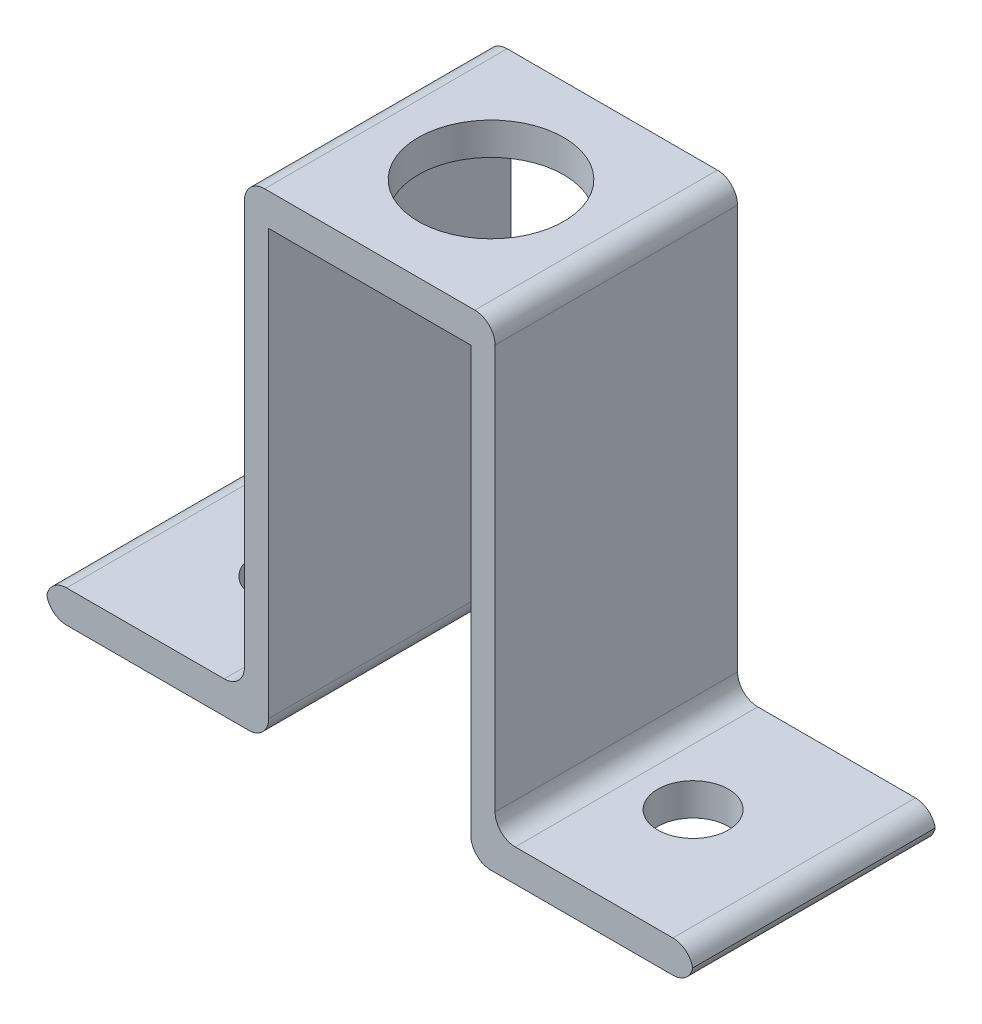
ISO-10303-21;
HEADER;
FILE_DESCRIPTION(('STEP AP214'),'2;1');
FILE_NAME('part.step','',(''),(''),'','','');
FILE_SCHEMA(('AUTOMOTIVE_DESIGN { 1 0 10303 214 1 1 1 1 }'));
ENDSEC;
DATA;
#1=APPLICATION_CONTEXT('core data for automotive mechanical design processes');
#2=APPLICATION_PROTOCOL_DEFINITION('international standard','automotive_design',2000,#1);
#3=PRODUCT_CONTEXT('',#1,'mechanical');
#4=PRODUCT('Part','Part','',(#3));
#5=PRODUCT_RELATED_PRODUCT_CATEGORY('part','',(#4));
#6=PRODUCT_DEFINITION_FORMATION('','',#4);
#7=PRODUCT_DEFINITION_CONTEXT('part definition',#1,'design');
#8=PRODUCT_DEFINITION('design','',#6,#7);
#9=PRODUCT_DEFINITION_SHAPE('','',#8);
#10=(LENGTH_UNIT() NAMED_UNIT(*) SI_UNIT(.MILLI.,.METRE.));
#11=(NAMED_UNIT(*) PLANE_ANGLE_UNIT() SI_UNIT($,.RADIAN.));
#12=(NAMED_UNIT(*) SI_UNIT($,.STERADIAN.) SOLID_ANGLE_UNIT());
#13=UNCERTAINTY_MEASURE_WITH_UNIT(LENGTH_MEASURE(1.E-05),#10,'distance_accuracy_value','');
#14=(GEOMETRIC_REPRESENTATION_CONTEXT(3) GLOBAL_UNCERTAINTY_ASSIGNED_CONTEXT((#13)) GLOBAL_UNIT_ASSIGNED_CONTEXT((#10,
#11,#12)) REPRESENTATION_CONTEXT('',''));
#15=CARTESIAN_POINT('',(0.,0.,0.));
#16=DIRECTION('',(0.,0.,1.));
#17=DIRECTION('',(1.,0.,0.));
#18=AXIS2_PLACEMENT_3D('',#15,#16,#17);
#19=CARTESIAN_POINT('',(6.2,-20.4,12.));
#20=DIRECTION('',(-1.,0.,0.));
#21=DIRECTION('',(0.,0.,1.));
#22=AXIS2_PLACEMENT_3D('',#19,#20,#21);
#23=PLANE('',#22);
#24=DIRECTION('',(0.,1.,0.));
#25=VECTOR('',#24,1.);
#26=CARTESIAN_POINT('',(6.2,-20.4,0.));
#27=LINE('',#26,#25);
#28=CARTESIAN_POINT('',(6.2,-19.4,0.));
#29=VERTEX_POINT('',#28);
#30=CARTESIAN_POINT('',(6.2,0.6,0.));
#31=VERTEX_POINT('',#30);
#32=EDGE_CURVE('E208',#29,#31,#27,.T.);
#33=ORIENTED_EDGE('',*,*,#32,.T.);
#34=DIRECTION('',(0.,0.,-1.));
#35=VECTOR('',#34,1.);
#36=CARTESIAN_POINT('',(6.2,0.6,12.));
#37=LINE('',#36,#35);
#38=CARTESIAN_POINT('',(6.2,0.6,12.));
#39=VERTEX_POINT('',#38);
#40=EDGE_CURVE('E302',#31,#39,#37,.F.);
#41=ORIENTED_EDGE('',*,*,#40,.T.);
#42=DIRECTION('',(0.,1.,0.));
#43=VECTOR('',#42,1.);
#44=CARTESIAN_POINT('',(6.2,-20.4,12.));
#45=LINE('',#44,#43);
#46=CARTESIAN_POINT('',(6.2,-19.4,12.));
#47=VERTEX_POINT('',#46);
#48=EDGE_CURVE('E236',#47,#39,#45,.T.);
#49=ORIENTED_EDGE('',*,*,#48,.F.);
#50=DIRECTION('',(0.,0.,-1.));
#51=VECTOR('',#50,1.);
#52=CARTESIAN_POINT('',(6.2,-19.4,0.));
#53=LINE('',#52,#51);
#54=EDGE_CURVE('E299',#47,#29,#53,.T.);
#55=ORIENTED_EDGE('',*,*,#54,.T.);
#56=EDGE_LOOP('',(#33,#41,#49,#55));
#57=FACE_BOUND('',#56,.T.);
#58=ADVANCED_FACE('F33',(#57),#23,.F.);
#59=CARTESIAN_POINT('',(-6.2,1.6,12.));
#60=DIRECTION('',(0.,-1.,0.));
#61=DIRECTION('',(0.,0.,-1.));
#62=AXIS2_PLACEMENT_3D('',#59,#60,#61);
#63=PLANE('',#62);
#64=CARTESIAN_POINT('',(0.,1.6,6.));
#65=DIRECTION('',(0.,1.,0.));
#66=DIRECTION('',(-1.,0.,0.));
#67=AXIS2_PLACEMENT_3D('',#64,#65,#66);
#68=CIRCLE('',#67,3.6);
#69=CARTESIAN_POINT('',(-3.6,1.6,6.));
#70=VERTEX_POINT('',#69);
#71=EDGE_CURVE('E240',#70,#70,#68,.T.);
#72=ORIENTED_EDGE('',*,*,#71,.F.);
#73=EDGE_LOOP('',(#72));
#74=FACE_BOUND('',#73,.T.);
#75=DIRECTION('',(-1.,0.,0.));
#76=VECTOR('',#75,1.);
#77=CARTESIAN_POINT('',(-6.2,1.6,0.));
#78=LINE('',#77,#76);
#79=CARTESIAN_POINT('',(5.2,1.6,0.));
#80=VERTEX_POINT('',#79);
#81=CARTESIAN_POINT('',(-5.2,1.6,0.));
#82=VERTEX_POINT('',#81);
#83=EDGE_CURVE('E211',#80,#82,#78,.T.);
#84=ORIENTED_EDGE('',*,*,#83,.T.);
#85=DIRECTION('',(0.,0.,-1.));
#86=VECTOR('',#85,1.);
#87=CARTESIAN_POINT('',(-5.2,1.6,12.));
#88=LINE('',#87,#86);
#89=CARTESIAN_POINT('',(-5.2,1.6,12.));
#90=VERTEX_POINT('',#89);
#91=EDGE_CURVE('E297',#82,#90,#88,.F.);
#92=ORIENTED_EDGE('',*,*,#91,.T.);
#93=DIRECTION('',(-1.,0.,0.));
#94=VECTOR('',#93,1.);
#95=CARTESIAN_POINT('',(-6.2,1.6,12.));
#96=LINE('',#95,#94);
#97=CARTESIAN_POINT('',(5.2,1.6,12.));
#98=VERTEX_POINT('',#97);
#99=EDGE_CURVE('E360',#98,#90,#96,.T.);
#100=ORIENTED_EDGE('',*,*,#99,.F.);
#101=DIRECTION('',(0.,0.,-1.));
#102=VECTOR('',#101,1.);
#103=CARTESIAN_POINT('',(5.2,1.6,12.));
#104=LINE('',#103,#102);
#105=EDGE_CURVE('E294',#98,#80,#104,.T.);
#106=ORIENTED_EDGE('',*,*,#105,.T.);
#107=EDGE_LOOP('',(#84,#92,#100,#106));
#108=FACE_BOUND('',#107,.T.);
#109=ADVANCED_FACE('F356',(#74,#108),#63,.F.);
#110=CARTESIAN_POINT('',(-6.2,-20.4,12.));
#111=DIRECTION('',(1.,0.,0.));
#112=DIRECTION('',(0.,0.,-1.));
#113=AXIS2_PLACEMENT_3D('',#110,#111,#112);
#114=PLANE('',#113);
#115=DIRECTION('',(0.,-1.,0.));
#116=VECTOR('',#115,1.);
#117=CARTESIAN_POINT('',(-6.2,-20.4,0.));
#118=LINE('',#117,#116);
#119=CARTESIAN_POINT('',(-6.2,0.6,0.));
#120=VERTEX_POINT('',#119);
#121=CARTESIAN_POINT('',(-6.2,-19.4,0.));
#122=VERTEX_POINT('',#121);
#123=EDGE_CURVE('E215',#120,#122,#118,.T.);
#124=ORIENTED_EDGE('',*,*,#123,.T.);
#125=DIRECTION('',(0.,0.,-1.));
#126=VECTOR('',#125,1.);
#127=CARTESIAN_POINT('',(-6.2,-19.4,12.));
#128=LINE('',#127,#126);
#129=CARTESIAN_POINT('',(-6.2,-19.4,12.));
#130=VERTEX_POINT('',#129);
#131=EDGE_CURVE('E292',#122,#130,#128,.F.);
#132=ORIENTED_EDGE('',*,*,#131,.T.);
#133=DIRECTION('',(0.,-1.,0.));
#134=VECTOR('',#133,1.);
#135=CARTESIAN_POINT('',(-6.2,-20.4,12.));
#136=LINE('',#135,#134);
#137=CARTESIAN_POINT('',(-6.2,0.6,12.));
#138=VERTEX_POINT('',#137);
#139=EDGE_CURVE('E349',#138,#130,#136,.T.);
#140=ORIENTED_EDGE('',*,*,#139,.F.);
#141=DIRECTION('',(0.,0.,-1.));
#142=VECTOR('',#141,1.);
#143=CARTESIAN_POINT('',(-6.2,0.6,12.));
#144=LINE('',#143,#142);
#145=EDGE_CURVE('E289',#138,#120,#144,.T.);
#146=ORIENTED_EDGE('',*,*,#145,.T.);
#147=EDGE_LOOP('',(#124,#132,#140,#146));
#148=FACE_BOUND('',#147,.T.);
#149=ADVANCED_FACE('F345',(#148),#114,.F.);
#150=CARTESIAN_POINT('',(-6.2,-20.4,12.));
#151=DIRECTION('',(0.,-1.,0.));
#152=DIRECTION('',(1.,0.,0.));
#153=AXIS2_PLACEMENT_3D('',#150,#151,#152);
#154=PLANE('',#153);
#155=CARTESIAN_POINT('',(-10.,-20.4,6.));
#156=DIRECTION('',(0.,1.,0.));
#157=DIRECTION('',(-1.,0.,0.));
#158=AXIS2_PLACEMENT_3D('',#155,#156,#157);
#159=CIRCLE('',#158,1.75);
#160=CARTESIAN_POINT('',(-11.75,-20.4,6.));
#161=VERTEX_POINT('',#160);
#162=EDGE_CURVE('E449',#161,#161,#159,.T.);
#163=ORIENTED_EDGE('',*,*,#162,.F.);
#164=EDGE_LOOP('',(#163));
#165=FACE_BOUND('',#164,.T.);
#166=DIRECTION('',(-1.,0.,0.));
#167=VECTOR('',#166,1.);
#168=CARTESIAN_POINT('',(-6.2,-20.4,0.));
#169=LINE('',#168,#167);
#170=CARTESIAN_POINT('',(-7.2,-20.4,0.));
#171=VERTEX_POINT('',#170);
#172=CARTESIAN_POINT('',(-15.,-20.4,0.));
#173=VERTEX_POINT('',#172);
#174=EDGE_CURVE('E218',#171,#173,#169,.T.);
#175=ORIENTED_EDGE('',*,*,#174,.T.);
#176=DIRECTION('',(0.,0.,-1.));
#177=VECTOR('',#176,1.);
#178=CARTESIAN_POINT('',(-15.,-20.4,12.));
#179=LINE('',#178,#177);
#180=CARTESIAN_POINT('',(-15.,-20.4,12.));
#181=VERTEX_POINT('',#180);
#182=EDGE_CURVE('E287',#173,#181,#179,.F.);
#183=ORIENTED_EDGE('',*,*,#182,.T.);
#184=DIRECTION('',(-1.,0.,0.));
#185=VECTOR('',#184,1.);
#186=CARTESIAN_POINT('',(-6.2,-20.4,12.));
#187=LINE('',#186,#185);
#188=CARTESIAN_POINT('',(-7.2,-20.4,12.));
#189=VERTEX_POINT('',#188);
#190=EDGE_CURVE('E338',#189,#181,#187,.T.);
#191=ORIENTED_EDGE('',*,*,#190,.F.);
#192=DIRECTION('',(0.,0.,-1.));
#193=VECTOR('',#192,1.);
#194=CARTESIAN_POINT('',(-7.2,-20.4,0.));
#195=LINE('',#194,#193);
#196=EDGE_CURVE('E284',#189,#171,#195,.T.);
#197=ORIENTED_EDGE('',*,*,#196,.T.);
#198=EDGE_LOOP('',(#175,#183,#191,#197));
#199=FACE_BOUND('',#198,.T.);
#200=ADVANCED_FACE('F335',(#165,#199),#154,.F.);
#201=CARTESIAN_POINT('',(-5.,-22.,12.));
#202=DIRECTION('',(0.,1.,0.));
#203=DIRECTION('',(0.,0.,1.));
#204=AXIS2_PLACEMENT_3D('',#201,#202,#203);
#205=PLANE('',#204);
#206=CARTESIAN_POINT('',(-10.,-22.,6.));
#207=DIRECTION('',(0.,1.,0.));
#208=DIRECTION('',(-1.,0.,0.));
#209=AXIS2_PLACEMENT_3D('',#206,#207,#208);
#210=CIRCLE('',#209,1.75);
#211=CARTESIAN_POINT('',(-11.75,-22.,6.));
#212=VERTEX_POINT('',#211);
#213=EDGE_CURVE('E448',#212,#212,#210,.T.);
#214=ORIENTED_EDGE('',*,*,#213,.T.);
#215=EDGE_LOOP('',(#214));
#216=FACE_BOUND('',#215,.T.);
#217=DIRECTION('',(1.,0.,0.));
#218=VECTOR('',#217,1.);
#219=CARTESIAN_POINT('',(-5.,-22.,12.));
#220=LINE('',#219,#218);
#221=CARTESIAN_POINT('',(-15.,-22.,12.));
#222=VERTEX_POINT('',#221);
#223=CARTESIAN_POINT('',(-6.,-22.,12.));
#224=VERTEX_POINT('',#223);
#225=EDGE_CURVE('E183',#222,#224,#220,.T.);
#226=ORIENTED_EDGE('',*,*,#225,.F.);
#227=DIRECTION('',(0.,0.,-1.));
#228=VECTOR('',#227,1.);
#229=CARTESIAN_POINT('',(-15.,-22.,12.));
#230=LINE('',#229,#228);
#231=CARTESIAN_POINT('',(-15.,-22.,0.));
#232=VERTEX_POINT('',#231);
#233=EDGE_CURVE('E276',#222,#232,#230,.T.);
#234=ORIENTED_EDGE('',*,*,#233,.T.);
#235=DIRECTION('',(1.,0.,0.));
#236=VECTOR('',#235,1.);
#237=CARTESIAN_POINT('',(-5.,-22.,0.));
#238=LINE('',#237,#236);
#239=CARTESIAN_POINT('',(-6.,-22.,0.));
#240=VERTEX_POINT('',#239);
#241=EDGE_CURVE('E221',#232,#240,#238,.T.);
#242=ORIENTED_EDGE('',*,*,#241,.T.);
#243=DIRECTION('',(0.,0.,-1.));
#244=VECTOR('',#243,1.);
#245=CARTESIAN_POINT('',(-6.,-22.,12.));
#246=LINE('',#245,#244);
#247=EDGE_CURVE('E274',#240,#224,#246,.F.);
#248=ORIENTED_EDGE('',*,*,#247,.T.);
#249=EDGE_LOOP('',(#226,#234,#242,#248));
#250=FACE_BOUND('',#249,.T.);
#251=ADVANCED_FACE('F440',(#216,#250),#205,.F.);
#252=CARTESIAN_POINT('',(-5.,0.,12.));
#253=DIRECTION('',(-1.,0.,0.));
#254=DIRECTION('',(0.,-1.,0.));
#255=AXIS2_PLACEMENT_3D('',#252,#253,#254);
#256=PLANE('',#255);
#257=DIRECTION('',(0.,1.,0.));
#258=VECTOR('',#257,1.);
#259=CARTESIAN_POINT('',(-5.,0.,12.));
#260=LINE('',#259,#258);
#261=CARTESIAN_POINT('',(-5.,-21.,12.));
#262=VERTEX_POINT('',#261);
#263=CARTESIAN_POINT('',(-5.,0.,12.));
#264=VERTEX_POINT('',#263);
#265=EDGE_CURVE('E170',#262,#264,#260,.T.);
#266=ORIENTED_EDGE('',*,*,#265,.F.);
#267=DIRECTION('',(0.,0.,-1.));
#268=VECTOR('',#267,1.);
#269=CARTESIAN_POINT('',(-5.,-21.,12.));
#270=LINE('',#269,#268);
#271=CARTESIAN_POINT('',(-5.,-21.,0.));
#272=VERTEX_POINT('',#271);
#273=EDGE_CURVE('E306',#262,#272,#270,.T.);
#274=ORIENTED_EDGE('',*,*,#273,.T.);
#275=DIRECTION('',(0.,1.,0.));
#276=VECTOR('',#275,1.);
#277=CARTESIAN_POINT('',(-5.,0.,0.));
#278=LINE('',#277,#276);
#279=CARTESIAN_POINT('',(-5.,0.,0.));
#280=VERTEX_POINT('',#279);
#281=EDGE_CURVE('E189',#272,#280,#278,.T.);
#282=ORIENTED_EDGE('',*,*,#281,.T.);
#283=DIRECTION('',(0.,0.,-1.));
#284=VECTOR('',#283,1.);
#285=CARTESIAN_POINT('',(-5.,0.,12.));
#286=LINE('',#285,#284);
#287=EDGE_CURVE('E186',#264,#280,#286,.T.);
#288=ORIENTED_EDGE('',*,*,#287,.F.);
#289=EDGE_LOOP('',(#266,#274,#282,#288));
#290=FACE_BOUND('',#289,.T.);
#291=ADVANCED_FACE('F187',(#290),#256,.F.);
#292=CARTESIAN_POINT('',(-5.,0.,12.));
#293=DIRECTION('',(0.,1.,0.));
#294=DIRECTION('',(-1.,0.,0.));
#295=AXIS2_PLACEMENT_3D('',#292,#293,#294);
#296=PLANE('',#295);
#297=CARTESIAN_POINT('',(0.,0.,6.));
#298=DIRECTION('',(0.,1.,0.));
#299=DIRECTION('',(-1.,0.,0.));
#300=AXIS2_PLACEMENT_3D('',#297,#298,#299);
#301=CIRCLE('',#300,3.6);
#302=CARTESIAN_POINT('',(-3.6,0.,6.));
#303=VERTEX_POINT('',#302);
#304=EDGE_CURVE('E212',#303,#303,#301,.T.);
#305=ORIENTED_EDGE('',*,*,#304,.T.);
#306=EDGE_LOOP('',(#305));
#307=FACE_BOUND('',#306,.T.);
#308=DIRECTION('',(1.,0.,0.));
#309=VECTOR('',#308,1.);
#310=CARTESIAN_POINT('',(-5.,0.,0.));
#311=LINE('',#310,#309);
#312=CARTESIAN_POINT('',(5.,0.,0.));
#313=VERTEX_POINT('',#312);
#314=EDGE_CURVE('E225',#280,#313,#311,.T.);
#315=ORIENTED_EDGE('',*,*,#314,.T.);
#316=DIRECTION('',(0.,0.,-1.));
#317=VECTOR('',#316,1.);
#318=CARTESIAN_POINT('',(5.,0.,12.));
#319=LINE('',#318,#317);
#320=CARTESIAN_POINT('',(5.,0.,12.));
#321=VERTEX_POINT('',#320);
#322=EDGE_CURVE('E193',#321,#313,#319,.T.);
#323=ORIENTED_EDGE('',*,*,#322,.F.);
#324=DIRECTION('',(1.,0.,0.));
#325=VECTOR('',#324,1.);
#326=CARTESIAN_POINT('',(-5.,0.,12.));
#327=LINE('',#326,#325);
#328=EDGE_CURVE('E175',#264,#321,#327,.T.);
#329=ORIENTED_EDGE('',*,*,#328,.F.);
#330=ORIENTED_EDGE('',*,*,#287,.T.);
#331=EDGE_LOOP('',(#315,#323,#329,#330));
#332=FACE_BOUND('',#331,.T.);
#333=ADVANCED_FACE('F195',(#307,#332),#296,.F.);
#334=CARTESIAN_POINT('',(5.,0.,12.));
#335=DIRECTION('',(1.,0.,0.));
#336=DIRECTION('',(0.,1.,0.));
#337=AXIS2_PLACEMENT_3D('',#334,#335,#336);
#338=PLANE('',#337);
#339=DIRECTION('',(0.,-1.,0.));
#340=VECTOR('',#339,1.);
#341=CARTESIAN_POINT('',(5.,0.,0.));
#342=LINE('',#341,#340);
#343=CARTESIAN_POINT('',(5.,-21.,0.));
#344=VERTEX_POINT('',#343);
#345=EDGE_CURVE('E227',#313,#344,#342,.T.);
#346=ORIENTED_EDGE('',*,*,#345,.T.);
#347=DIRECTION('',(0.,0.,-1.));
#348=VECTOR('',#347,1.);
#349=CARTESIAN_POINT('',(5.,-21.,12.));
#350=LINE('',#349,#348);
#351=CARTESIAN_POINT('',(5.,-21.,12.));
#352=VERTEX_POINT('',#351);
#353=EDGE_CURVE('E304',#344,#352,#350,.F.);
#354=ORIENTED_EDGE('',*,*,#353,.T.);
#355=DIRECTION('',(0.,-1.,0.));
#356=VECTOR('',#355,1.);
#357=CARTESIAN_POINT('',(5.,0.,12.));
#358=LINE('',#357,#356);
#359=EDGE_CURVE('E198',#321,#352,#358,.T.);
#360=ORIENTED_EDGE('',*,*,#359,.F.);
#361=ORIENTED_EDGE('',*,*,#322,.T.);
#362=EDGE_LOOP('',(#346,#354,#360,#361));
#363=FACE_BOUND('',#362,.T.);
#364=ADVANCED_FACE('F394',(#363),#338,.F.);
#365=CARTESIAN_POINT('',(5.,-22.,12.));
#366=DIRECTION('',(0.,1.,0.));
#367=DIRECTION('',(0.,0.,1.));
#368=AXIS2_PLACEMENT_3D('',#365,#366,#367);
#369=PLANE('',#368);
#370=CARTESIAN_POINT('',(9.99999999999999,-22.,6.));
#371=DIRECTION('',(0.,1.,0.));
#372=DIRECTION('',(-1.,0.,0.));
#373=AXIS2_PLACEMENT_3D('',#370,#371,#372);
#374=CIRCLE('',#373,1.75);
#375=CARTESIAN_POINT('',(8.24999999999999,-22.,6.));
#376=VERTEX_POINT('',#375);
#377=EDGE_CURVE('E318',#376,#376,#374,.T.);
#378=ORIENTED_EDGE('',*,*,#377,.T.);
#379=EDGE_LOOP('',(#378));
#380=FACE_BOUND('',#379,.T.);
#381=DIRECTION('',(1.,0.,0.));
#382=VECTOR('',#381,1.);
#383=CARTESIAN_POINT('',(5.,-22.,0.));
#384=LINE('',#383,#382);
#385=CARTESIAN_POINT('',(6.,-22.,0.));
#386=VERTEX_POINT('',#385);
#387=CARTESIAN_POINT('',(15.,-22.,0.));
#388=VERTEX_POINT('',#387);
#389=EDGE_CURVE('E230',#386,#388,#384,.T.);
#390=ORIENTED_EDGE('',*,*,#389,.T.);
#391=DIRECTION('',(0.,0.,-1.));
#392=VECTOR('',#391,1.);
#393=CARTESIAN_POINT('',(15.,-22.,12.));
#394=LINE('',#393,#392);
#395=CARTESIAN_POINT('',(15.,-22.,12.));
#396=VERTEX_POINT('',#395);
#397=EDGE_CURVE('E282',#388,#396,#394,.F.);
#398=ORIENTED_EDGE('',*,*,#397,.T.);
#399=DIRECTION('',(1.,0.,0.));
#400=VECTOR('',#399,1.);
#401=CARTESIAN_POINT('',(5.,-22.,12.));
#402=LINE('',#401,#400);
#403=CARTESIAN_POINT('',(6.,-22.,12.));
#404=VERTEX_POINT('',#403);
#405=EDGE_CURVE('E200',#404,#396,#402,.T.);
#406=ORIENTED_EDGE('',*,*,#405,.F.);
#407=DIRECTION('',(0.,0.,-1.));
#408=VECTOR('',#407,1.);
#409=CARTESIAN_POINT('',(6.,-22.,12.));
#410=LINE('',#409,#408);
#411=EDGE_CURVE('E279',#404,#386,#410,.T.);
#412=ORIENTED_EDGE('',*,*,#411,.T.);
#413=EDGE_LOOP('',(#390,#398,#406,#412));
#414=FACE_BOUND('',#413,.T.);
#415=ADVANCED_FACE('F386',(#380,#414),#369,.F.);
#416=CARTESIAN_POINT('',(6.2,-20.4,12.));
#417=DIRECTION('',(0.,-1.,0.));
#418=DIRECTION('',(1.,0.,0.));
#419=AXIS2_PLACEMENT_3D('',#416,#417,#418);
#420=PLANE('',#419);
#421=CARTESIAN_POINT('',(9.99999999999999,-20.4,6.));
#422=DIRECTION('',(0.,1.,0.));
#423=DIRECTION('',(-1.,0.,0.));
#424=AXIS2_PLACEMENT_3D('',#421,#422,#423);
#425=CIRCLE('',#424,1.75);
#426=CARTESIAN_POINT('',(8.24999999999999,-20.4,6.));
#427=VERTEX_POINT('',#426);
#428=EDGE_CURVE('E314',#427,#427,#425,.T.);
#429=ORIENTED_EDGE('',*,*,#428,.F.);
#430=EDGE_LOOP('',(#429));
#431=FACE_BOUND('',#430,.T.);
#432=DIRECTION('',(-1.,0.,0.));
#433=VECTOR('',#432,1.);
#434=CARTESIAN_POINT('',(6.2,-20.4,12.));
#435=LINE('',#434,#433);
#436=CARTESIAN_POINT('',(15.,-20.4,12.));
#437=VERTEX_POINT('',#436);
#438=CARTESIAN_POINT('',(7.2,-20.4,12.));
#439=VERTEX_POINT('',#438);
#440=EDGE_CURVE('E205',#437,#439,#435,.T.);
#441=ORIENTED_EDGE('',*,*,#440,.F.);
#442=DIRECTION('',(0.,0.,-1.));
#443=VECTOR('',#442,1.);
#444=CARTESIAN_POINT('',(15.,-20.4,12.));
#445=LINE('',#444,#443);
#446=CARTESIAN_POINT('',(15.,-20.4,0.));
#447=VERTEX_POINT('',#446);
#448=EDGE_CURVE('E242',#437,#447,#445,.T.);
#449=ORIENTED_EDGE('',*,*,#448,.T.);
#450=DIRECTION('',(-1.,0.,0.));
#451=VECTOR('',#450,1.);
#452=CARTESIAN_POINT('',(6.2,-20.4,0.));
#453=LINE('',#452,#451);
#454=CARTESIAN_POINT('',(7.2,-20.4,0.));
#455=VERTEX_POINT('',#454);
#456=EDGE_CURVE('E233',#447,#455,#453,.T.);
#457=ORIENTED_EDGE('',*,*,#456,.T.);
#458=DIRECTION('',(0.,0.,-1.));
#459=VECTOR('',#458,1.);
#460=CARTESIAN_POINT('',(7.2,-20.4,12.));
#461=LINE('',#460,#459);
#462=EDGE_CURVE('E192',#455,#439,#461,.F.);
#463=ORIENTED_EDGE('',*,*,#462,.T.);
#464=EDGE_LOOP('',(#441,#449,#457,#463));
#465=FACE_BOUND('',#464,.T.);
#466=ADVANCED_FACE('F376',(#431,#465),#420,.F.);
#467=CARTESIAN_POINT('',(0.,0.,12.));
#468=DIRECTION('',(0.,0.,-1.));
#469=DIRECTION('',(-1.,0.,0.));
#470=AXIS2_PLACEMENT_3D('',#467,#468,#469);
#471=PLANE('',#470);
#472=CARTESIAN_POINT('',(15.,-21.,12.));
#473=DIRECTION('',(0.,0.,-1.));
#474=DIRECTION('',(-1.,0.,0.));
#475=AXIS2_PLACEMENT_3D('',#472,#473,#474);
#476=CIRCLE('',#475,1.);
#477=CARTESIAN_POINT('',(15.9797958971133,-21.2,12.));
#478=VERTEX_POINT('',#477);
#479=EDGE_CURVE('E50',#396,#478,#476,.F.);
#480=ORIENTED_EDGE('',*,*,#479,.T.);
#481=CARTESIAN_POINT('',(15.,-21.4,12.));
#482=DIRECTION('',(0.,0.,-1.));
#483=DIRECTION('',(-1.,0.,0.));
#484=AXIS2_PLACEMENT_3D('',#481,#482,#483);
#485=CIRCLE('',#484,1.);
#486=EDGE_CURVE('E272',#478,#437,#485,.F.);
#487=ORIENTED_EDGE('',*,*,#486,.T.);
#488=ORIENTED_EDGE('',*,*,#440,.T.);
#489=CARTESIAN_POINT('',(7.2,-19.4,12.));
#490=DIRECTION('',(0.,0.,-1.));
#491=DIRECTION('',(-1.,0.,0.));
#492=AXIS2_PLACEMENT_3D('',#489,#490,#491);
#493=CIRCLE('',#492,1.);
#494=EDGE_CURVE('E11',#439,#47,#493,.T.);
#495=ORIENTED_EDGE('',*,*,#494,.T.);
#496=ORIENTED_EDGE('',*,*,#48,.T.);
#497=CARTESIAN_POINT('',(5.2,0.6,12.));
#498=DIRECTION('',(0.,0.,-1.));
#499=DIRECTION('',(-1.,0.,0.));
#500=AXIS2_PLACEMENT_3D('',#497,#498,#499);
#501=CIRCLE('',#500,1.);
#502=EDGE_CURVE('E264',#39,#98,#501,.F.);
#503=ORIENTED_EDGE('',*,*,#502,.T.);
#504=ORIENTED_EDGE('',*,*,#99,.T.);
#505=CARTESIAN_POINT('',(-5.2,0.6,12.));
#506=DIRECTION('',(0.,0.,-1.));
#507=DIRECTION('',(-1.,0.,0.));
#508=AXIS2_PLACEMENT_3D('',#505,#506,#507);
#509=CIRCLE('',#508,1.);
#510=EDGE_CURVE('E266',#90,#138,#509,.F.);
#511=ORIENTED_EDGE('',*,*,#510,.T.);
#512=ORIENTED_EDGE('',*,*,#139,.T.);
#513=CARTESIAN_POINT('',(-7.2,-19.4,12.));
#514=DIRECTION('',(0.,0.,-1.));
#515=DIRECTION('',(-1.,0.,0.));
#516=AXIS2_PLACEMENT_3D('',#513,#514,#515);
#517=CIRCLE('',#516,1.);
#518=EDGE_CURVE('E310',#130,#189,#517,.T.);
#519=ORIENTED_EDGE('',*,*,#518,.T.);
#520=ORIENTED_EDGE('',*,*,#190,.T.);
#521=CARTESIAN_POINT('',(-15.,-21.4,12.));
#522=DIRECTION('',(0.,0.,-1.));
#523=DIRECTION('',(-1.,0.,0.));
#524=AXIS2_PLACEMENT_3D('',#521,#522,#523);
#525=CIRCLE('',#524,1.);
#526=CARTESIAN_POINT('',(-15.9797958971133,-21.2,12.));
#527=VERTEX_POINT('',#526);
#528=EDGE_CURVE('E57',#181,#527,#525,.F.);
#529=ORIENTED_EDGE('',*,*,#528,.T.);
#530=CARTESIAN_POINT('',(-15.,-21.,12.));
#531=DIRECTION('',(0.,0.,-1.));
#532=DIRECTION('',(-1.,0.,0.));
#533=AXIS2_PLACEMENT_3D('',#530,#531,#532);
#534=CIRCLE('',#533,1.);
#535=EDGE_CURVE('E269',#527,#222,#534,.F.);
#536=ORIENTED_EDGE('',*,*,#535,.T.);
#537=ORIENTED_EDGE('',*,*,#225,.T.);
#538=CARTESIAN_POINT('',(-6.,-21.,12.));
#539=DIRECTION('',(0.,0.,-1.));
#540=DIRECTION('',(-1.,0.,0.));
#541=AXIS2_PLACEMENT_3D('',#538,#539,#540);
#542=CIRCLE('',#541,1.);
#543=EDGE_CURVE('E179',#224,#262,#542,.F.);
#544=ORIENTED_EDGE('',*,*,#543,.T.);
#545=ORIENTED_EDGE('',*,*,#265,.T.);
#546=ORIENTED_EDGE('',*,*,#328,.T.);
#547=ORIENTED_EDGE('',*,*,#359,.T.);
#548=CARTESIAN_POINT('',(6.,-21.,12.));
#549=DIRECTION('',(0.,0.,-1.));
#550=DIRECTION('',(-1.,0.,0.));
#551=AXIS2_PLACEMENT_3D('',#548,#549,#550);
#552=CIRCLE('',#551,1.);
#553=EDGE_CURVE('E262',#352,#404,#552,.F.);
#554=ORIENTED_EDGE('',*,*,#553,.T.);
#555=ORIENTED_EDGE('',*,*,#405,.T.);
#556=EDGE_LOOP('',(#480,#487,#488,#495,#496,#503,#504,#511,#512,#519,#520,#529,#536,#537,#544,
#545,#546,#547,#554,#555));
#557=FACE_BOUND('',#556,.T.);
#558=ADVANCED_FACE('F172',(#557),#471,.F.);
#559=CARTESIAN_POINT('',(0.,0.,0.));
#560=DIRECTION('',(0.,0.,-1.));
#561=DIRECTION('',(-1.,0.,0.));
#562=AXIS2_PLACEMENT_3D('',#559,#560,#561);
#563=PLANE('',#562);
#564=ORIENTED_EDGE('',*,*,#456,.F.);
#565=CARTESIAN_POINT('',(15.,-21.4,0.));
#566=DIRECTION('',(0.,0.,-1.));
#567=DIRECTION('',(-1.,0.,0.));
#568=AXIS2_PLACEMENT_3D('',#565,#566,#567);
#569=CIRCLE('',#568,1.);
#570=CARTESIAN_POINT('',(15.9797958971133,-21.2,0.));
#571=VERTEX_POINT('',#570);
#572=EDGE_CURVE('E259',#447,#571,#569,.T.);
#573=ORIENTED_EDGE('',*,*,#572,.T.);
#574=CARTESIAN_POINT('',(15.,-21.,0.));
#575=DIRECTION('',(0.,0.,-1.));
#576=DIRECTION('',(-1.,0.,0.));
#577=AXIS2_PLACEMENT_3D('',#574,#575,#576);
#578=CIRCLE('',#577,1.);
#579=EDGE_CURVE('E257',#571,#388,#578,.T.);
#580=ORIENTED_EDGE('',*,*,#579,.T.);
#581=ORIENTED_EDGE('',*,*,#389,.F.);
#582=CARTESIAN_POINT('',(6.,-21.,0.));
#583=DIRECTION('',(0.,0.,-1.));
#584=DIRECTION('',(-1.,0.,0.));
#585=AXIS2_PLACEMENT_3D('',#582,#583,#584);
#586=CIRCLE('',#585,1.);
#587=EDGE_CURVE('E247',#386,#344,#586,.T.);
#588=ORIENTED_EDGE('',*,*,#587,.T.);
#589=ORIENTED_EDGE('',*,*,#345,.F.);
#590=ORIENTED_EDGE('',*,*,#314,.F.);
#591=ORIENTED_EDGE('',*,*,#281,.F.);
#592=CARTESIAN_POINT('',(-6.,-21.,0.));
#593=DIRECTION('',(0.,0.,-1.));
#594=DIRECTION('',(-1.,0.,0.));
#595=AXIS2_PLACEMENT_3D('',#592,#593,#594);
#596=CIRCLE('',#595,1.);
#597=EDGE_CURVE('E245',#272,#240,#596,.T.);
#598=ORIENTED_EDGE('',*,*,#597,.T.);
#599=ORIENTED_EDGE('',*,*,#241,.F.);
#600=CARTESIAN_POINT('',(-15.,-21.,0.));
#601=DIRECTION('',(0.,0.,-1.));
#602=DIRECTION('',(-1.,0.,0.));
#603=AXIS2_PLACEMENT_3D('',#600,#601,#602);
#604=CIRCLE('',#603,1.);
#605=CARTESIAN_POINT('',(-15.9797958971133,-21.2,0.));
#606=VERTEX_POINT('',#605);
#607=EDGE_CURVE('E255',#232,#606,#604,.T.);
#608=ORIENTED_EDGE('',*,*,#607,.T.);
#609=CARTESIAN_POINT('',(-15.,-21.4,0.));
#610=DIRECTION('',(0.,0.,-1.));
#611=DIRECTION('',(-1.,0.,0.));
#612=AXIS2_PLACEMENT_3D('',#609,#610,#611);
#613=CIRCLE('',#612,1.);
#614=EDGE_CURVE('E253',#606,#173,#613,.T.);
#615=ORIENTED_EDGE('',*,*,#614,.T.);
#616=ORIENTED_EDGE('',*,*,#174,.F.);
#617=CARTESIAN_POINT('',(-7.2,-19.4,0.));
#618=DIRECTION('',(0.,0.,-1.));
#619=DIRECTION('',(-1.,0.,0.));
#620=AXIS2_PLACEMENT_3D('',#617,#618,#619);
#621=CIRCLE('',#620,1.);
#622=EDGE_CURVE('E308',#171,#122,#621,.F.);
#623=ORIENTED_EDGE('',*,*,#622,.T.);
#624=ORIENTED_EDGE('',*,*,#123,.F.);
#625=CARTESIAN_POINT('',(-5.2,0.6,0.));
#626=DIRECTION('',(0.,0.,-1.));
#627=DIRECTION('',(-1.,0.,0.));
#628=AXIS2_PLACEMENT_3D('',#625,#626,#627);
#629=CIRCLE('',#628,1.);
#630=EDGE_CURVE('E251',#120,#82,#629,.T.);
#631=ORIENTED_EDGE('',*,*,#630,.T.);
#632=ORIENTED_EDGE('',*,*,#83,.F.);
#633=CARTESIAN_POINT('',(5.2,0.6,0.));
#634=DIRECTION('',(0.,0.,-1.));
#635=DIRECTION('',(-1.,0.,0.));
#636=AXIS2_PLACEMENT_3D('',#633,#634,#635);
#637=CIRCLE('',#636,1.);
#638=EDGE_CURVE('E249',#80,#31,#637,.T.);
#639=ORIENTED_EDGE('',*,*,#638,.T.);
#640=ORIENTED_EDGE('',*,*,#32,.F.);
#641=CARTESIAN_POINT('',(7.2,-19.4,0.));
#642=DIRECTION('',(0.,0.,-1.));
#643=DIRECTION('',(-1.,0.,0.));
#644=AXIS2_PLACEMENT_3D('',#641,#642,#643);
#645=CIRCLE('',#644,1.);
#646=EDGE_CURVE('E42',#29,#455,#645,.F.);
#647=ORIENTED_EDGE('',*,*,#646,.T.);
#648=EDGE_LOOP('',(#564,#573,#580,#581,#588,#589,#590,#591,#598,#599,#608,#615,#616,#623,#624,
#631,#632,#639,#640,#647));
#649=FACE_BOUND('',#648,.T.);
#650=ADVANCED_FACE('F332',(#649),#563,.T.);
#651=CARTESIAN_POINT('',(0.,-22.,6.));
#652=DIRECTION('',(0.,1.,0.));
#653=DIRECTION('',(-1.,0.,0.));
#654=AXIS2_PLACEMENT_3D('',#651,#652,#653);
#655=CYLINDRICAL_SURFACE('',#654,3.6);
#656=ORIENTED_EDGE('',*,*,#71,.T.);
#657=EDGE_LOOP('',(#656));
#658=FACE_BOUND('',#657,.T.);
#659=ORIENTED_EDGE('',*,*,#304,.F.);
#660=EDGE_LOOP('',(#659));
#661=FACE_BOUND('',#660,.T.);
#662=ADVANCED_FACE('F471',(#658,#661),#655,.F.);
#663=CARTESIAN_POINT('',(-10.,-22.,6.));
#664=DIRECTION('',(0.,1.,0.));
#665=DIRECTION('',(-1.,0.,0.));
#666=AXIS2_PLACEMENT_3D('',#663,#664,#665);
#667=CYLINDRICAL_SURFACE('',#666,1.75);
#668=ORIENTED_EDGE('',*,*,#213,.F.);
#669=EDGE_LOOP('',(#668));
#670=FACE_BOUND('',#669,.T.);
#671=ORIENTED_EDGE('',*,*,#162,.T.);
#672=EDGE_LOOP('',(#671));
#673=FACE_BOUND('',#672,.T.);
#674=ADVANCED_FACE('F459',(#670,#673),#667,.F.);
#675=CARTESIAN_POINT('',(9.99999999999999,-22.,6.));
#676=DIRECTION('',(0.,1.,0.));
#677=DIRECTION('',(-1.,0.,0.));
#678=AXIS2_PLACEMENT_3D('',#675,#676,#677);
#679=CYLINDRICAL_SURFACE('',#678,1.75);
#680=ORIENTED_EDGE('',*,*,#377,.F.);
#681=EDGE_LOOP('',(#680));
#682=FACE_BOUND('',#681,.T.);
#683=ORIENTED_EDGE('',*,*,#428,.T.);
#684=EDGE_LOOP('',(#683));
#685=FACE_BOUND('',#684,.T.);
#686=ADVANCED_FACE('F418',(#682,#685),#679,.F.);
#687=CARTESIAN_POINT('',(15.,-21.,12.));
#688=DIRECTION('',(0.,0.,-1.));
#689=DIRECTION('',(-1.,0.,0.));
#690=AXIS2_PLACEMENT_3D('',#687,#688,#689);
#691=CYLINDRICAL_SURFACE('',#690,1.);
#692=DIRECTION('',(0.,0.,-1.));
#693=VECTOR('',#692,1.);
#694=CARTESIAN_POINT('',(15.9797958971133,-21.2,6.));
#695=LINE('',#694,#693);
#696=EDGE_CURVE('E312',#478,#571,#695,.T.);
#697=ORIENTED_EDGE('',*,*,#696,.F.);
#698=ORIENTED_EDGE('',*,*,#479,.F.);
#699=ORIENTED_EDGE('',*,*,#397,.F.);
#700=ORIENTED_EDGE('',*,*,#579,.F.);
#701=EDGE_LOOP('',(#697,#698,#699,#700));
#702=FACE_BOUND('',#701,.T.);
#703=ADVANCED_FACE('F383',(#702),#691,.T.);
#704=CARTESIAN_POINT('',(15.,-21.4,12.));
#705=DIRECTION('',(0.,0.,-1.));
#706=DIRECTION('',(-1.,0.,0.));
#707=AXIS2_PLACEMENT_3D('',#704,#705,#706);
#708=CYLINDRICAL_SURFACE('',#707,1.);
#709=ORIENTED_EDGE('',*,*,#486,.F.);
#710=ORIENTED_EDGE('',*,*,#696,.T.);
#711=ORIENTED_EDGE('',*,*,#572,.F.);
#712=ORIENTED_EDGE('',*,*,#448,.F.);
#713=EDGE_LOOP('',(#709,#710,#711,#712));
#714=FACE_BOUND('',#713,.T.);
#715=ADVANCED_FACE('F378',(#714),#708,.T.);
#716=CARTESIAN_POINT('',(-15.,-21.4,12.));
#717=DIRECTION('',(0.,0.,-1.));
#718=DIRECTION('',(-1.,0.,0.));
#719=AXIS2_PLACEMENT_3D('',#716,#717,#718);
#720=CYLINDRICAL_SURFACE('',#719,1.);
#721=DIRECTION('',(0.,0.,-1.));
#722=VECTOR('',#721,1.);
#723=CARTESIAN_POINT('',(-15.9797958971133,-21.2,6.));
#724=LINE('',#723,#722);
#725=EDGE_CURVE('E37',#527,#606,#724,.T.);
#726=ORIENTED_EDGE('',*,*,#725,.F.);
#727=ORIENTED_EDGE('',*,*,#528,.F.);
#728=ORIENTED_EDGE('',*,*,#182,.F.);
#729=ORIENTED_EDGE('',*,*,#614,.F.);
#730=EDGE_LOOP('',(#726,#727,#728,#729));
#731=FACE_BOUND('',#730,.T.);
#732=ADVANCED_FACE('F327',(#731),#720,.T.);
#733=CARTESIAN_POINT('',(-15.,-21.,12.));
#734=DIRECTION('',(0.,0.,-1.));
#735=DIRECTION('',(-1.,0.,0.));
#736=AXIS2_PLACEMENT_3D('',#733,#734,#735);
#737=CYLINDRICAL_SURFACE('',#736,1.);
#738=ORIENTED_EDGE('',*,*,#535,.F.);
#739=ORIENTED_EDGE('',*,*,#725,.T.);
#740=ORIENTED_EDGE('',*,*,#607,.F.);
#741=ORIENTED_EDGE('',*,*,#233,.F.);
#742=EDGE_LOOP('',(#738,#739,#740,#741));
#743=FACE_BOUND('',#742,.T.);
#744=ADVANCED_FACE('F323',(#743),#737,.T.);
#745=CARTESIAN_POINT('',(-7.2,-19.4,12.));
#746=DIRECTION('',(0.,0.,1.));
#747=DIRECTION('',(1.,0.,0.));
#748=AXIS2_PLACEMENT_3D('',#745,#746,#747);
#749=CYLINDRICAL_SURFACE('',#748,1.);
#750=ORIENTED_EDGE('',*,*,#518,.F.);
#751=ORIENTED_EDGE('',*,*,#131,.F.);
#752=ORIENTED_EDGE('',*,*,#622,.F.);
#753=ORIENTED_EDGE('',*,*,#196,.F.);
#754=EDGE_LOOP('',(#750,#751,#752,#753));
#755=FACE_BOUND('',#754,.T.);
#756=ADVANCED_FACE('F341',(#755),#749,.F.);
#757=CARTESIAN_POINT('',(-5.2,0.6,12.));
#758=DIRECTION('',(0.,0.,-1.));
#759=DIRECTION('',(-1.,0.,0.));
#760=AXIS2_PLACEMENT_3D('',#757,#758,#759);
#761=CYLINDRICAL_SURFACE('',#760,1.);
#762=ORIENTED_EDGE('',*,*,#510,.F.);
#763=ORIENTED_EDGE('',*,*,#91,.F.);
#764=ORIENTED_EDGE('',*,*,#630,.F.);
#765=ORIENTED_EDGE('',*,*,#145,.F.);
#766=EDGE_LOOP('',(#762,#763,#764,#765));
#767=FACE_BOUND('',#766,.T.);
#768=ADVANCED_FACE('F352',(#767),#761,.T.);
#769=CARTESIAN_POINT('',(5.2,0.6,12.));
#770=DIRECTION('',(0.,0.,-1.));
#771=DIRECTION('',(-1.,0.,0.));
#772=AXIS2_PLACEMENT_3D('',#769,#770,#771);
#773=CYLINDRICAL_SURFACE('',#772,1.);
#774=ORIENTED_EDGE('',*,*,#502,.F.);
#775=ORIENTED_EDGE('',*,*,#40,.F.);
#776=ORIENTED_EDGE('',*,*,#638,.F.);
#777=ORIENTED_EDGE('',*,*,#105,.F.);
#778=EDGE_LOOP('',(#774,#775,#776,#777));
#779=FACE_BOUND('',#778,.T.);
#780=ADVANCED_FACE('F363',(#779),#773,.T.);
#781=CARTESIAN_POINT('',(7.2,-19.4,12.));
#782=DIRECTION('',(0.,0.,1.));
#783=DIRECTION('',(1.,0.,0.));
#784=AXIS2_PLACEMENT_3D('',#781,#782,#783);
#785=CYLINDRICAL_SURFACE('',#784,1.);
#786=ORIENTED_EDGE('',*,*,#494,.F.);
#787=ORIENTED_EDGE('',*,*,#462,.F.);
#788=ORIENTED_EDGE('',*,*,#646,.F.);
#789=ORIENTED_EDGE('',*,*,#54,.F.);
#790=EDGE_LOOP('',(#786,#787,#788,#789));
#791=FACE_BOUND('',#790,.T.);
#792=ADVANCED_FACE('F372',(#791),#785,.F.);
#793=CARTESIAN_POINT('',(6.,-21.,12.));
#794=DIRECTION('',(0.,0.,-1.));
#795=DIRECTION('',(-1.,0.,0.));
#796=AXIS2_PLACEMENT_3D('',#793,#794,#795);
#797=CYLINDRICAL_SURFACE('',#796,1.);
#798=ORIENTED_EDGE('',*,*,#553,.F.);
#799=ORIENTED_EDGE('',*,*,#353,.F.);
#800=ORIENTED_EDGE('',*,*,#587,.F.);
#801=ORIENTED_EDGE('',*,*,#411,.F.);
#802=EDGE_LOOP('',(#798,#799,#800,#801));
#803=FACE_BOUND('',#802,.T.);
#804=ADVANCED_FACE('F391',(#803),#797,.T.);
#805=CARTESIAN_POINT('',(-6.,-21.,12.));
#806=DIRECTION('',(0.,0.,-1.));
#807=DIRECTION('',(-1.,0.,0.));
#808=AXIS2_PLACEMENT_3D('',#805,#806,#807);
#809=CYLINDRICAL_SURFACE('',#808,1.);
#810=ORIENTED_EDGE('',*,*,#543,.F.);
#811=ORIENTED_EDGE('',*,*,#247,.F.);
#812=ORIENTED_EDGE('',*,*,#597,.F.);
#813=ORIENTED_EDGE('',*,*,#273,.F.);
#814=EDGE_LOOP('',(#810,#811,#812,#813));
#815=FACE_BOUND('',#814,.T.);
#816=ADVANCED_FACE('F35',(#815),#809,.T.);
#817=CLOSED_SHELL('',(#58,#109,#149,#200,#251,#291,#333,#364,#415,#466,#558,#650,#662,#674,#686,
#703,#715,#732,#744,#756,#768,#780,#792,#804,#816));
#818=MANIFOLD_SOLID_BREP('B2',#817);
#819=ADVANCED_BREP_SHAPE_REPRESENTATION('',(#18,#818),#14);
#820=SHAPE_DEFINITION_REPRESENTATION(#9,#819);
ENDSEC;
END-ISO-10303-21;
